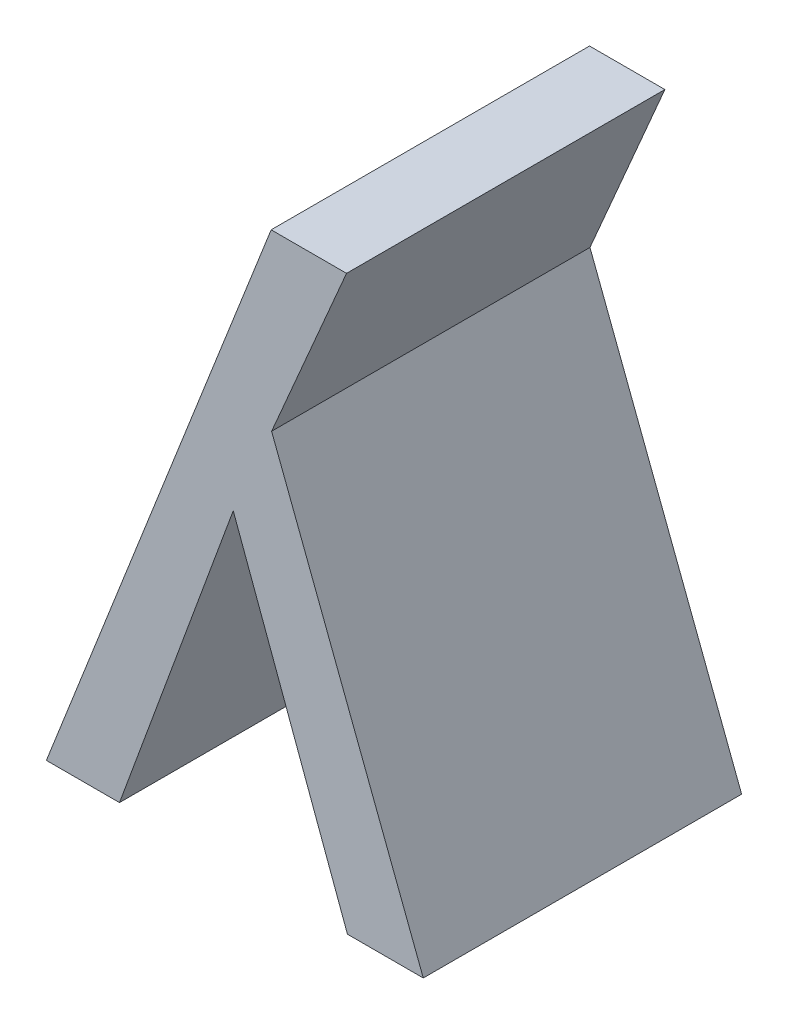
ISO-10303-21;
HEADER;
FILE_DESCRIPTION(('STEP AP214'),'2;1');
FILE_NAME('part.step','',(''),(''),'','','');
FILE_SCHEMA(('AUTOMOTIVE_DESIGN { 1 0 10303 214 1 1 1 1 }'));
ENDSEC;
DATA;
#1=APPLICATION_CONTEXT('core data for automotive mechanical design processes');
#2=APPLICATION_PROTOCOL_DEFINITION('international standard','automotive_design',2000,#1);
#3=PRODUCT_CONTEXT('',#1,'mechanical');
#4=PRODUCT('Part','Part','',(#3));
#5=PRODUCT_RELATED_PRODUCT_CATEGORY('part','',(#4));
#6=PRODUCT_DEFINITION_FORMATION('','',#4);
#7=PRODUCT_DEFINITION_CONTEXT('part definition',#1,'design');
#8=PRODUCT_DEFINITION('design','',#6,#7);
#9=PRODUCT_DEFINITION_SHAPE('','',#8);
#10=(LENGTH_UNIT() NAMED_UNIT(*) SI_UNIT(.MILLI.,.METRE.));
#11=(NAMED_UNIT(*) PLANE_ANGLE_UNIT() SI_UNIT($,.RADIAN.));
#12=(NAMED_UNIT(*) SI_UNIT($,.STERADIAN.) SOLID_ANGLE_UNIT());
#13=UNCERTAINTY_MEASURE_WITH_UNIT(LENGTH_MEASURE(1.E-05),#10,'distance_accuracy_value','');
#14=(GEOMETRIC_REPRESENTATION_CONTEXT(3) GLOBAL_UNCERTAINTY_ASSIGNED_CONTEXT((#13)) GLOBAL_UNIT_ASSIGNED_CONTEXT((#10,
#11,#12)) REPRESENTATION_CONTEXT('',''));
#15=CARTESIAN_POINT('',(0.,0.,0.));
#16=DIRECTION('',(0.,0.,1.));
#17=DIRECTION('',(1.,0.,0.));
#18=AXIS2_PLACEMENT_3D('',#15,#16,#17);
#19=CARTESIAN_POINT('',(5.4410507871806,1.7024853847124,0.));
#20=DIRECTION('',(0.,1.,0.));
#21=DIRECTION('',(-1.,0.,0.));
#22=AXIS2_PLACEMENT_3D('',#19,#20,#21);
#23=PLANE('',#22);
#24=DIRECTION('',(1.,0.,0.));
#25=VECTOR('',#24,1.);
#26=CARTESIAN_POINT('',(5.4173730549044,1.7024853847124,0.));
#27=LINE('',#26,#25);
#28=CARTESIAN_POINT('',(5.4173730549044,1.7024853847124,0.));
#29=VERTEX_POINT('',#28);
#30=CARTESIAN_POINT('',(5.4410507871806,1.7024853847124,0.));
#31=VERTEX_POINT('',#30);
#32=EDGE_CURVE('E11',#29,#31,#27,.T.);
#33=ORIENTED_EDGE('',*,*,#32,.F.);
#34=DIRECTION('',(0.,0.,1.));
#35=VECTOR('',#34,1.);
#36=CARTESIAN_POINT('',(5.4173730549044,1.7024853847124,0.));
#37=LINE('',#36,#35);
#38=CARTESIAN_POINT('',(5.4173730549044,1.7024853847124,0.1));
#39=VERTEX_POINT('',#38);
#40=EDGE_CURVE('E24',#29,#39,#37,.T.);
#41=ORIENTED_EDGE('',*,*,#40,.T.);
#42=DIRECTION('',(-1.,0.,0.));
#43=VECTOR('',#42,1.);
#44=CARTESIAN_POINT('',(5.4173730549044,1.7024853847124,0.1));
#45=LINE('',#44,#43);
#46=CARTESIAN_POINT('',(5.4410507871806,1.7024853847124,0.1));
#47=VERTEX_POINT('',#46);
#48=EDGE_CURVE('E100',#47,#39,#45,.T.);
#49=ORIENTED_EDGE('',*,*,#48,.F.);
#50=DIRECTION('',(0.,0.,1.));
#51=VECTOR('',#50,1.);
#52=CARTESIAN_POINT('',(5.4410507871806,1.7024853847124,0.));
#53=LINE('',#52,#51);
#54=EDGE_CURVE('E141',#31,#47,#53,.T.);
#55=ORIENTED_EDGE('',*,*,#54,.F.);
#56=EDGE_LOOP('',(#33,#41,#49,#55));
#57=FACE_BOUND('',#56,.T.);
#58=ADVANCED_FACE('F17',(#57),#23,.T.);
#59=CARTESIAN_POINT('',(5.4175148377324,1.6477572131038,0.));
#60=DIRECTION('',(0.918651913198301,-0.395067921220011,0.));
#61=DIRECTION('',(0.395067921220011,0.918651913198301,0.));
#62=AXIS2_PLACEMENT_3D('',#59,#60,#61);
#63=PLANE('',#62);
#64=DIRECTION('',(-0.395067921220011,-0.918651913198301,0.));
#65=VECTOR('',#64,1.);
#66=CARTESIAN_POINT('',(5.4410507871806,1.7024853847124,0.));
#67=LINE('',#66,#65);
#68=CARTESIAN_POINT('',(5.4175148377324,1.6477572131038,0.));
#69=VERTEX_POINT('',#68);
#70=EDGE_CURVE('E139',#31,#69,#67,.T.);
#71=ORIENTED_EDGE('',*,*,#70,.F.);
#72=ORIENTED_EDGE('',*,*,#54,.T.);
#73=DIRECTION('',(0.395067921220011,0.918651913198301,0.));
#74=VECTOR('',#73,1.);
#75=CARTESIAN_POINT('',(5.4410507871806,1.7024853847124,0.1));
#76=LINE('',#75,#74);
#77=CARTESIAN_POINT('',(5.4175148377324,1.6477572131038,0.1));
#78=VERTEX_POINT('',#77);
#79=EDGE_CURVE('E137',#78,#47,#76,.T.);
#80=ORIENTED_EDGE('',*,*,#79,.F.);
#81=DIRECTION('',(0.,0.,1.));
#82=VECTOR('',#81,1.);
#83=CARTESIAN_POINT('',(5.4175148377324,1.6477572131038,0.));
#84=LINE('',#83,#82);
#85=EDGE_CURVE('E134',#69,#78,#84,.T.);
#86=ORIENTED_EDGE('',*,*,#85,.F.);
#87=EDGE_LOOP('',(#71,#72,#80,#86));
#88=FACE_BOUND('',#87,.T.);
#89=ADVANCED_FACE('F163',(#88),#63,.T.);
#90=CARTESIAN_POINT('',(5.4651538679408,1.5228465416346,0.));
#91=DIRECTION('',(0.934353260734934,0.356348122141813,0.));
#92=DIRECTION('',(-0.356348122141813,0.934353260734934,0.));
#93=AXIS2_PLACEMENT_3D('',#90,#91,#92);
#94=PLANE('',#93);
#95=DIRECTION('',(0.356348122141813,-0.934353260734934,0.));
#96=VECTOR('',#95,1.);
#97=CARTESIAN_POINT('',(5.4175148377324,1.6477572131038,0.));
#98=LINE('',#97,#96);
#99=CARTESIAN_POINT('',(5.4651538679408,1.5228465416346,0.));
#100=VERTEX_POINT('',#99);
#101=EDGE_CURVE('E132',#69,#100,#98,.T.);
#102=ORIENTED_EDGE('',*,*,#101,.F.);
#103=ORIENTED_EDGE('',*,*,#85,.T.);
#104=DIRECTION('',(-0.356348122141813,0.934353260734934,0.));
#105=VECTOR('',#104,1.);
#106=CARTESIAN_POINT('',(5.4175148377324,1.6477572131038,0.1));
#107=LINE('',#106,#105);
#108=CARTESIAN_POINT('',(5.4651538679408,1.5228465416346,0.1));
#109=VERTEX_POINT('',#108);
#110=EDGE_CURVE('E129',#109,#78,#107,.T.);
#111=ORIENTED_EDGE('',*,*,#110,.F.);
#112=DIRECTION('',(0.,0.,1.));
#113=VECTOR('',#112,1.);
#114=CARTESIAN_POINT('',(5.4651538679408,1.5228465416346,0.));
#115=LINE('',#114,#113);
#116=EDGE_CURVE('E126',#100,#109,#115,.T.);
#117=ORIENTED_EDGE('',*,*,#116,.F.);
#118=EDGE_LOOP('',(#102,#103,#111,#117));
#119=FACE_BOUND('',#118,.T.);
#120=ADVANCED_FACE('F159',(#119),#94,.T.);
#121=CARTESIAN_POINT('',(5.4413343528366,1.5228465416346,0.));
#122=DIRECTION('',(0.,-1.,0.));
#123=DIRECTION('',(1.,0.,0.));
#124=AXIS2_PLACEMENT_3D('',#121,#122,#123);
#125=PLANE('',#124);
#126=DIRECTION('',(-1.,0.,0.));
#127=VECTOR('',#126,1.);
#128=CARTESIAN_POINT('',(5.4651538679408,1.5228465416346,0.));
#129=LINE('',#128,#127);
#130=CARTESIAN_POINT('',(5.4413343528366,1.5228465416346,0.));
#131=VERTEX_POINT('',#130);
#132=EDGE_CURVE('E124',#100,#131,#129,.T.);
#133=ORIENTED_EDGE('',*,*,#132,.F.);
#134=ORIENTED_EDGE('',*,*,#116,.T.);
#135=DIRECTION('',(1.,0.,0.));
#136=VECTOR('',#135,1.);
#137=CARTESIAN_POINT('',(5.4651538679408,1.5228465416346,0.1));
#138=LINE('',#137,#136);
#139=CARTESIAN_POINT('',(5.4413343528366,1.5228465416346,0.1));
#140=VERTEX_POINT('',#139);
#141=EDGE_CURVE('E121',#140,#109,#138,.T.);
#142=ORIENTED_EDGE('',*,*,#141,.F.);
#143=DIRECTION('',(0.,0.,1.));
#144=VECTOR('',#143,1.);
#145=CARTESIAN_POINT('',(5.4413343528366,1.5228465416346,0.));
#146=LINE('',#145,#144);
#147=EDGE_CURVE('E118',#131,#140,#146,.T.);
#148=ORIENTED_EDGE('',*,*,#147,.F.);
#149=EDGE_LOOP('',(#133,#134,#142,#148));
#150=FACE_BOUND('',#149,.T.);
#151=ADVANCED_FACE('F155',(#150),#125,.T.);
#152=CARTESIAN_POINT('',(5.4054632973523,1.6201095616436,0.));
#153=DIRECTION('',(-0.938226310403916,-0.346022239842838,0.));
#154=DIRECTION('',(0.346022239842838,-0.938226310403916,0.));
#155=AXIS2_PLACEMENT_3D('',#152,#153,#154);
#156=PLANE('',#155);
#157=DIRECTION('',(-0.346022239842838,0.938226310403916,0.));
#158=VECTOR('',#157,1.);
#159=CARTESIAN_POINT('',(5.4413343528366,1.5228465416346,0.));
#160=LINE('',#159,#158);
#161=CARTESIAN_POINT('',(5.4054632973523,1.6201095616435,0.));
#162=VERTEX_POINT('',#161);
#163=EDGE_CURVE('E116',#131,#162,#160,.T.);
#164=ORIENTED_EDGE('',*,*,#163,.F.);
#165=ORIENTED_EDGE('',*,*,#147,.T.);
#166=DIRECTION('',(0.346022239842838,-0.938226310403916,0.));
#167=VECTOR('',#166,1.);
#168=CARTESIAN_POINT('',(5.4413343528366,1.5228465416346,0.1));
#169=LINE('',#168,#167);
#170=CARTESIAN_POINT('',(5.4054632973523,1.6201095616435,0.1));
#171=VERTEX_POINT('',#170);
#172=EDGE_CURVE('E113',#171,#140,#169,.T.);
#173=ORIENTED_EDGE('',*,*,#172,.F.);
#174=DIRECTION('',(0.,0.,1.));
#175=VECTOR('',#174,1.);
#176=CARTESIAN_POINT('',(5.4054632973523,1.6201095616435,0.));
#177=LINE('',#176,#175);
#178=EDGE_CURVE('E110',#162,#171,#177,.T.);
#179=ORIENTED_EDGE('',*,*,#178,.F.);
#180=EDGE_LOOP('',(#164,#165,#173,#179));
#181=FACE_BOUND('',#180,.T.);
#182=ADVANCED_FACE('F151',(#181),#156,.T.);
#183=CARTESIAN_POINT('',(5.3697340246959,1.5228465416346,0.));
#184=DIRECTION('',(0.938669759516727,-0.344817462679618,0.));
#185=DIRECTION('',(0.344817462679618,0.938669759516727,0.));
#186=AXIS2_PLACEMENT_3D('',#183,#184,#185);
#187=PLANE('',#186);
#188=DIRECTION('',(-0.344817462679618,-0.938669759516727,0.));
#189=VECTOR('',#188,1.);
#190=CARTESIAN_POINT('',(5.4054632973523,1.6201095616435,0.));
#191=LINE('',#190,#189);
#192=CARTESIAN_POINT('',(5.3697340246959,1.5228465416346,0.));
#193=VERTEX_POINT('',#192);
#194=EDGE_CURVE('E108',#162,#193,#191,.T.);
#195=ORIENTED_EDGE('',*,*,#194,.F.);
#196=ORIENTED_EDGE('',*,*,#178,.T.);
#197=DIRECTION('',(0.344817462679618,0.938669759516727,0.));
#198=VECTOR('',#197,1.);
#199=CARTESIAN_POINT('',(5.4054632973523,1.6201095616435,0.1));
#200=LINE('',#199,#198);
#201=CARTESIAN_POINT('',(5.3697340246959,1.5228465416346,0.1));
#202=VERTEX_POINT('',#201);
#203=EDGE_CURVE('E106',#202,#171,#200,.T.);
#204=ORIENTED_EDGE('',*,*,#203,.F.);
#205=DIRECTION('',(0.,0.,1.));
#206=VECTOR('',#205,1.);
#207=CARTESIAN_POINT('',(5.3697340246959,1.5228465416346,0.));
#208=LINE('',#207,#206);
#209=EDGE_CURVE('E85',#193,#202,#208,.T.);
#210=ORIENTED_EDGE('',*,*,#209,.F.);
#211=EDGE_LOOP('',(#195,#196,#204,#210));
#212=FACE_BOUND('',#211,.T.);
#213=ADVANCED_FACE('F149',(#212),#187,.T.);
#214=CARTESIAN_POINT('',(5.3467652065597,1.5228465416346,0.));
#215=DIRECTION('',(0.,-1.,0.));
#216=DIRECTION('',(1.,0.,0.));
#217=AXIS2_PLACEMENT_3D('',#214,#215,#216);
#218=PLANE('',#217);
#219=DIRECTION('',(-1.,0.,0.));
#220=VECTOR('',#219,1.);
#221=CARTESIAN_POINT('',(5.3697340246959,1.5228465416346,0.));
#222=LINE('',#221,#220);
#223=CARTESIAN_POINT('',(5.3467652065597,1.5228465416346,0.));
#224=VERTEX_POINT('',#223);
#225=EDGE_CURVE('E89',#193,#224,#222,.T.);
#226=ORIENTED_EDGE('',*,*,#225,.F.);
#227=ORIENTED_EDGE('',*,*,#209,.T.);
#228=DIRECTION('',(1.,0.,0.));
#229=VECTOR('',#228,1.);
#230=CARTESIAN_POINT('',(5.3697340246959,1.5228465416346,0.1));
#231=LINE('',#230,#229);
#232=CARTESIAN_POINT('',(5.3467652065597,1.5228465416346,0.1));
#233=VERTEX_POINT('',#232);
#234=EDGE_CURVE('E78',#233,#202,#231,.T.);
#235=ORIENTED_EDGE('',*,*,#234,.F.);
#236=DIRECTION('',(0.,0.,1.));
#237=VECTOR('',#236,1.);
#238=CARTESIAN_POINT('',(5.3467652065597,1.5228465416346,0.));
#239=LINE('',#238,#237);
#240=EDGE_CURVE('E82',#224,#233,#239,.T.);
#241=ORIENTED_EDGE('',*,*,#240,.F.);
#242=EDGE_LOOP('',(#226,#227,#235,#241));
#243=FACE_BOUND('',#242,.T.);
#244=ADVANCED_FACE('F81',(#243),#218,.T.);
#245=CARTESIAN_POINT('',(5.4173730549044,1.7024853847124,0.));
#246=DIRECTION('',(-0.930688981271206,0.365811454359161,0.));
#247=DIRECTION('',(-0.365811454359161,-0.930688981271206,0.));
#248=AXIS2_PLACEMENT_3D('',#245,#246,#247);
#249=PLANE('',#248);
#250=DIRECTION('',(0.365811454359161,0.930688981271206,0.));
#251=VECTOR('',#250,1.);
#252=CARTESIAN_POINT('',(5.3467652065597,1.5228465416346,0.));
#253=LINE('',#252,#251);
#254=EDGE_CURVE('E95',#224,#29,#253,.T.);
#255=ORIENTED_EDGE('',*,*,#254,.F.);
#256=ORIENTED_EDGE('',*,*,#240,.T.);
#257=DIRECTION('',(-0.365811454359161,-0.930688981271206,0.));
#258=VECTOR('',#257,1.);
#259=CARTESIAN_POINT('',(5.3467652065597,1.5228465416346,0.1));
#260=LINE('',#259,#258);
#261=EDGE_CURVE('E94',#39,#233,#260,.T.);
#262=ORIENTED_EDGE('',*,*,#261,.F.);
#263=ORIENTED_EDGE('',*,*,#40,.F.);
#264=EDGE_LOOP('',(#255,#256,#262,#263));
#265=FACE_BOUND('',#264,.T.);
#266=ADVANCED_FACE('F93',(#265),#249,.T.);
#267=CARTESIAN_POINT('',(5.4089620257065,1.5967767737379,0.));
#268=DIRECTION('',(0.,0.,1.));
#269=DIRECTION('',(1.,0.,0.));
#270=AXIS2_PLACEMENT_3D('',#267,#268,#269);
#271=PLANE('',#270);
#272=ORIENTED_EDGE('',*,*,#254,.T.);
#273=ORIENTED_EDGE('',*,*,#32,.T.);
#274=ORIENTED_EDGE('',*,*,#70,.T.);
#275=ORIENTED_EDGE('',*,*,#101,.T.);
#276=ORIENTED_EDGE('',*,*,#132,.T.);
#277=ORIENTED_EDGE('',*,*,#163,.T.);
#278=ORIENTED_EDGE('',*,*,#194,.T.);
#279=ORIENTED_EDGE('',*,*,#225,.T.);
#280=EDGE_LOOP('',(#272,#273,#274,#275,#276,#277,#278,#279));
#281=FACE_BOUND('',#280,.T.);
#282=ADVANCED_FACE('F144',(#281),#271,.F.);
#283=CARTESIAN_POINT('',(5.4089620257065,1.5967767737379,0.1));
#284=DIRECTION('',(0.,0.,1.));
#285=DIRECTION('',(1.,0.,0.));
#286=AXIS2_PLACEMENT_3D('',#283,#284,#285);
#287=PLANE('',#286);
#288=ORIENTED_EDGE('',*,*,#261,.T.);
#289=ORIENTED_EDGE('',*,*,#234,.T.);
#290=ORIENTED_EDGE('',*,*,#203,.T.);
#291=ORIENTED_EDGE('',*,*,#172,.T.);
#292=ORIENTED_EDGE('',*,*,#141,.T.);
#293=ORIENTED_EDGE('',*,*,#110,.T.);
#294=ORIENTED_EDGE('',*,*,#79,.T.);
#295=ORIENTED_EDGE('',*,*,#48,.T.);
#296=EDGE_LOOP('',(#288,#289,#290,#291,#292,#293,#294,#295));
#297=FACE_BOUND('',#296,.T.);
#298=ADVANCED_FACE('F98',(#297),#287,.T.);
#299=CLOSED_SHELL('',(#58,#89,#120,#151,#182,#213,#244,#266,#282,#298));
#300=MANIFOLD_SOLID_BREP('B1',#299);
#301=ADVANCED_BREP_SHAPE_REPRESENTATION('',(#18,#300),#14);
#302=SHAPE_DEFINITION_REPRESENTATION(#9,#301);
ENDSEC;
END-ISO-10303-21;
